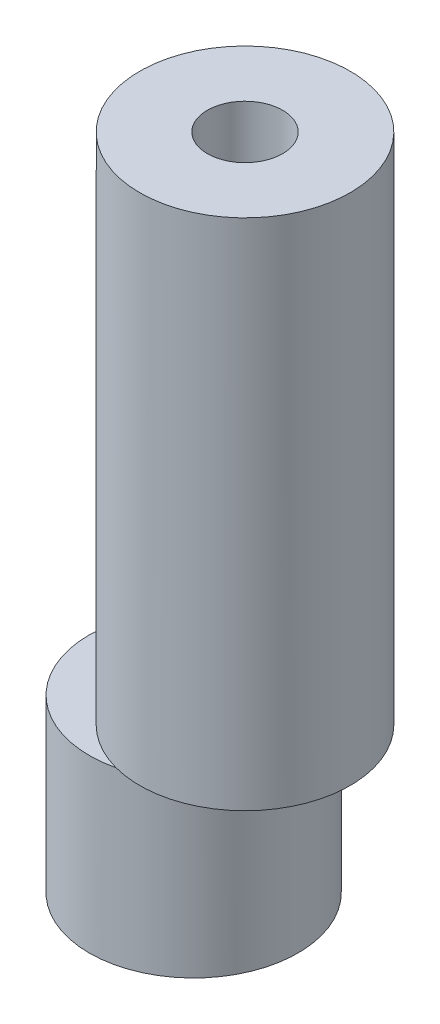
ISO-10303-21;
HEADER;
FILE_DESCRIPTION(('STEP AP214'),'2;1');
FILE_NAME('part.step','',(''),(''),'','','');
FILE_SCHEMA(('AUTOMOTIVE_DESIGN { 1 0 10303 214 1 1 1 1 }'));
ENDSEC;
DATA;
#1=APPLICATION_CONTEXT('core data for automotive mechanical design processes');
#2=APPLICATION_PROTOCOL_DEFINITION('international standard','automotive_design',2000,#1);
#3=PRODUCT_CONTEXT('',#1,'mechanical');
#4=PRODUCT('Part','Part','',(#3));
#5=PRODUCT_RELATED_PRODUCT_CATEGORY('part','',(#4));
#6=PRODUCT_DEFINITION_FORMATION('','',#4);
#7=PRODUCT_DEFINITION_CONTEXT('part definition',#1,'design');
#8=PRODUCT_DEFINITION('design','',#6,#7);
#9=PRODUCT_DEFINITION_SHAPE('','',#8);
#10=(LENGTH_UNIT() NAMED_UNIT(*) SI_UNIT(.MILLI.,.METRE.));
#11=(NAMED_UNIT(*) PLANE_ANGLE_UNIT() SI_UNIT($,.RADIAN.));
#12=(NAMED_UNIT(*) SI_UNIT($,.STERADIAN.) SOLID_ANGLE_UNIT());
#13=UNCERTAINTY_MEASURE_WITH_UNIT(LENGTH_MEASURE(1.E-05),#10,'distance_accuracy_value','');
#14=(GEOMETRIC_REPRESENTATION_CONTEXT(3) GLOBAL_UNCERTAINTY_ASSIGNED_CONTEXT((#13)) GLOBAL_UNIT_ASSIGNED_CONTEXT((#10,
#11,#12)) REPRESENTATION_CONTEXT('',''));
#15=CARTESIAN_POINT('',(0.,0.,0.));
#16=DIRECTION('',(0.,0.,1.));
#17=DIRECTION('',(1.,0.,0.));
#18=AXIS2_PLACEMENT_3D('',#15,#16,#17);
#19=CARTESIAN_POINT('',(0.,5.,0.));
#20=DIRECTION('',(0.,-1.,0.));
#21=DIRECTION('',(0.,0.,-1.));
#22=AXIS2_PLACEMENT_3D('',#19,#20,#21);
#23=CYLINDRICAL_SURFACE('',#22,3.05);
#24=CARTESIAN_POINT('',(0.,5.,0.));
#25=DIRECTION('',(0.,1.,0.));
#26=DIRECTION('',(0.,0.,1.));
#27=AXIS2_PLACEMENT_3D('',#24,#25,#26);
#28=CIRCLE('',#27,3.05);
#29=CARTESIAN_POINT('',(0.698958333333334,5.,2.96883095649852));
#30=VERTEX_POINT('',#29);
#31=CARTESIAN_POINT('',(0.698958333333334,5.,-2.96883095649851));
#32=VERTEX_POINT('',#31);
#33=EDGE_CURVE('E11',#30,#32,#28,.T.);
#34=ORIENTED_EDGE('',*,*,#33,.F.);
#35=EDGE_CURVE('E45',#32,#30,#28,.T.);
#36=ORIENTED_EDGE('',*,*,#35,.F.);
#37=EDGE_LOOP('',(#34,#36));
#38=FACE_BOUND('',#37,.T.);
#39=CARTESIAN_POINT('',(0.,0.,0.));
#40=DIRECTION('',(0.,1.,0.));
#41=DIRECTION('',(0.,0.,1.));
#42=AXIS2_PLACEMENT_3D('',#39,#40,#41);
#43=CIRCLE('',#42,3.05);
#44=CARTESIAN_POINT('',(0.,0.,3.05));
#45=VERTEX_POINT('',#44);
#46=EDGE_CURVE('E40',#45,#45,#43,.T.);
#47=ORIENTED_EDGE('',*,*,#46,.T.);
#48=EDGE_LOOP('',(#47));
#49=FACE_BOUND('',#48,.T.);
#50=ADVANCED_FACE('F37',(#38,#49),#23,.T.);
#51=CARTESIAN_POINT('',(0.,5.,0.));
#52=DIRECTION('',(0.,1.,0.));
#53=DIRECTION('',(0.,0.,1.));
#54=AXIS2_PLACEMENT_3D('',#51,#52,#53);
#55=PLANE('',#54);
#56=CARTESIAN_POINT('',(1.5,5.,0.));
#57=DIRECTION('',(0.,1.,0.));
#58=DIRECTION('',(0.,0.,1.));
#59=AXIS2_PLACEMENT_3D('',#56,#57,#58);
#60=CIRCLE('',#59,3.075);
#61=EDGE_CURVE('E51',#32,#30,#60,.T.);
#62=ORIENTED_EDGE('',*,*,#61,.F.);
#63=ORIENTED_EDGE('',*,*,#35,.T.);
#64=EDGE_LOOP('',(#62,#63));
#65=FACE_BOUND('',#64,.T.);
#66=ADVANCED_FACE('F59',(#65),#55,.T.);
#67=CARTESIAN_POINT('',(0.,0.,0.));
#68=DIRECTION('',(0.,1.,0.));
#69=DIRECTION('',(0.,0.,1.));
#70=AXIS2_PLACEMENT_3D('',#67,#68,#69);
#71=PLANE('',#70);
#72=ORIENTED_EDGE('',*,*,#46,.F.);
#73=EDGE_LOOP('',(#72));
#74=FACE_BOUND('',#73,.T.);
#75=ADVANCED_FACE('F89',(#74),#71,.F.);
#76=CARTESIAN_POINT('',(1.5,5.,0.));
#77=DIRECTION('',(0.,1.,0.));
#78=DIRECTION('',(0.,0.,1.));
#79=AXIS2_PLACEMENT_3D('',#76,#77,#78);
#80=PLANE('',#79);
#81=EDGE_CURVE('E60',#30,#32,#60,.T.);
#82=ORIENTED_EDGE('',*,*,#81,.F.);
#83=ORIENTED_EDGE('',*,*,#33,.T.);
#84=EDGE_LOOP('',(#82,#83));
#85=FACE_BOUND('',#84,.T.);
#86=ADVANCED_FACE('F61',(#85),#80,.F.);
#87=CARTESIAN_POINT('',(1.5,20.,0.));
#88=DIRECTION('',(0.,1.,0.));
#89=DIRECTION('',(0.,0.,1.));
#90=AXIS2_PLACEMENT_3D('',#87,#88,#89);
#91=PLANE('',#90);
#92=CARTESIAN_POINT('',(1.5,20.,0.));
#93=DIRECTION('',(0.,1.,0.));
#94=DIRECTION('',(0.,0.,1.));
#95=AXIS2_PLACEMENT_3D('',#92,#93,#94);
#96=CIRCLE('',#95,3.075);
#97=CARTESIAN_POINT('',(1.5,20.,3.075));
#98=VERTEX_POINT('',#97);
#99=EDGE_CURVE('E66',#98,#98,#96,.T.);
#100=ORIENTED_EDGE('',*,*,#99,.T.);
#101=EDGE_LOOP('',(#100));
#102=FACE_BOUND('',#101,.T.);
#103=CARTESIAN_POINT('',(1.5,20.,0.));
#104=DIRECTION('',(0.,1.,0.));
#105=DIRECTION('',(0.,0.,1.));
#106=AXIS2_PLACEMENT_3D('',#103,#104,#105);
#107=CIRCLE('',#106,1.1);
#108=CARTESIAN_POINT('',(1.5,20.,1.1));
#109=VERTEX_POINT('',#108);
#110=EDGE_CURVE('E63',#109,#109,#107,.T.);
#111=ORIENTED_EDGE('',*,*,#110,.F.);
#112=EDGE_LOOP('',(#111));
#113=FACE_BOUND('',#112,.T.);
#114=ADVANCED_FACE('F79',(#102,#113),#91,.T.);
#115=CARTESIAN_POINT('',(1.5,20.,0.));
#116=DIRECTION('',(0.,-1.,0.));
#117=DIRECTION('',(0.,0.,-1.));
#118=AXIS2_PLACEMENT_3D('',#115,#116,#117);
#119=CYLINDRICAL_SURFACE('',#118,3.075);
#120=ORIENTED_EDGE('',*,*,#99,.F.);
#121=EDGE_LOOP('',(#120));
#122=FACE_BOUND('',#121,.T.);
#123=ORIENTED_EDGE('',*,*,#61,.T.);
#124=ORIENTED_EDGE('',*,*,#81,.T.);
#125=EDGE_LOOP('',(#123,#124));
#126=FACE_BOUND('',#125,.T.);
#127=ADVANCED_FACE('F65',(#122,#126),#119,.T.);
#128=CARTESIAN_POINT('',(1.5,20.,0.));
#129=DIRECTION('',(0.,-1.,0.));
#130=DIRECTION('',(0.,0.,-1.));
#131=AXIS2_PLACEMENT_3D('',#128,#129,#130);
#132=CYLINDRICAL_SURFACE('',#131,1.1);
#133=ORIENTED_EDGE('',*,*,#110,.T.);
#134=EDGE_LOOP('',(#133));
#135=FACE_BOUND('',#134,.T.);
#136=CARTESIAN_POINT('',(1.5,5.,0.));
#137=DIRECTION('',(0.,1.,0.));
#138=DIRECTION('',(0.,0.,1.));
#139=AXIS2_PLACEMENT_3D('',#136,#137,#138);
#140=CIRCLE('',#139,1.1);
#141=CARTESIAN_POINT('',(1.5,5.,1.1));
#142=VERTEX_POINT('',#141);
#143=EDGE_CURVE('E70',#142,#142,#140,.T.);
#144=ORIENTED_EDGE('',*,*,#143,.F.);
#145=EDGE_LOOP('',(#144));
#146=FACE_BOUND('',#145,.T.);
#147=ADVANCED_FACE('F76',(#135,#146),#132,.F.);
#148=ORIENTED_EDGE('',*,*,#143,.T.);
#149=EDGE_LOOP('',(#148));
#150=FACE_BOUND('',#149,.T.);
#151=ADVANCED_FACE('F97',(#150),#55,.T.);
#152=CLOSED_SHELL('',(#50,#66,#75,#86,#114,#127,#147,#151));
#153=MANIFOLD_SOLID_BREP('B2',#152);
#154=ADVANCED_BREP_SHAPE_REPRESENTATION('',(#18,#153),#14);
#155=SHAPE_DEFINITION_REPRESENTATION(#9,#154);
ENDSEC;
END-ISO-10303-21;
